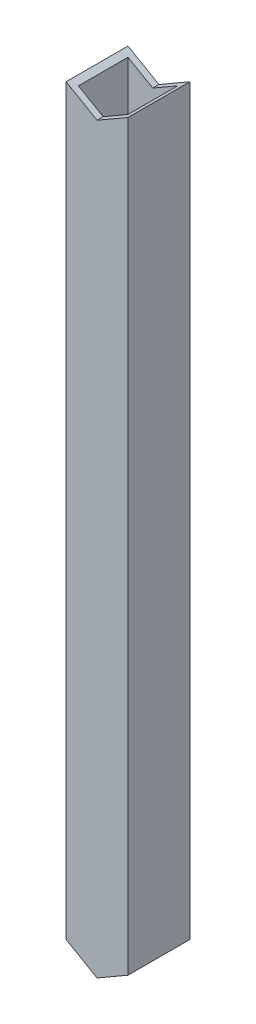
ISO-10303-21;
HEADER;
FILE_DESCRIPTION(('STEP AP214'),'2;1');
FILE_NAME('part.step','',(''),(''),'','','');
FILE_SCHEMA(('AUTOMOTIVE_DESIGN { 1 0 10303 214 1 1 1 1 }'));
ENDSEC;
DATA;
#1=APPLICATION_CONTEXT('core data for automotive mechanical design processes');
#2=APPLICATION_PROTOCOL_DEFINITION('international standard','automotive_design',2000,#1);
#3=PRODUCT_CONTEXT('',#1,'mechanical');
#4=PRODUCT('Part','Part','',(#3));
#5=PRODUCT_RELATED_PRODUCT_CATEGORY('part','',(#4));
#6=PRODUCT_DEFINITION_FORMATION('','',#4);
#7=PRODUCT_DEFINITION_CONTEXT('part definition',#1,'design');
#8=PRODUCT_DEFINITION('design','',#6,#7);
#9=PRODUCT_DEFINITION_SHAPE('','',#8);
#10=(LENGTH_UNIT() NAMED_UNIT(*) SI_UNIT(.MILLI.,.METRE.));
#11=(NAMED_UNIT(*) PLANE_ANGLE_UNIT() SI_UNIT($,.RADIAN.));
#12=(NAMED_UNIT(*) SI_UNIT($,.STERADIAN.) SOLID_ANGLE_UNIT());
#13=UNCERTAINTY_MEASURE_WITH_UNIT(LENGTH_MEASURE(1.E-05),#10,'distance_accuracy_value','');
#14=(GEOMETRIC_REPRESENTATION_CONTEXT(3) GLOBAL_UNCERTAINTY_ASSIGNED_CONTEXT((#13)) GLOBAL_UNIT_ASSIGNED_CONTEXT((#10,
#11,#12)) REPRESENTATION_CONTEXT('',''));
#15=CARTESIAN_POINT('',(0.,0.,0.));
#16=DIRECTION('',(0.,0.,1.));
#17=DIRECTION('',(1.,0.,0.));
#18=AXIS2_PLACEMENT_3D('',#15,#16,#17);
#19=CARTESIAN_POINT('',(0.,0.,50.));
#20=DIRECTION('',(-0.500000000000004,-0.866025403784436,0.));
#21=DIRECTION('',(0.866025403784436,-0.500000000000004,0.));
#22=AXIS2_PLACEMENT_3D('',#19,#20,#21);
#23=PLANE('',#22);
#24=DIRECTION('',(0.,0.,-1.));
#25=VECTOR('',#24,1.);
#26=CARTESIAN_POINT('',(-20.,11.5470053837926,50.));
#27=LINE('',#26,#25);
#28=CARTESIAN_POINT('',(-20.,11.5470053837926,45.));
#29=VERTEX_POINT('',#28);
#30=CARTESIAN_POINT('',(-20.,11.5470053837926,5.));
#31=VERTEX_POINT('',#30);
#32=EDGE_CURVE('E181',#29,#31,#27,.T.);
#33=ORIENTED_EDGE('',*,*,#32,.T.);
#34=DIRECTION('',(0.866025403784436,-0.500000000000004,0.));
#35=VECTOR('',#34,1.);
#36=CARTESIAN_POINT('',(0.,0.,5.));
#37=LINE('',#36,#35);
#38=CARTESIAN_POINT('',(0.,0.,5.));
#39=VERTEX_POINT('',#38);
#40=EDGE_CURVE('E202',#31,#39,#37,.T.);
#41=ORIENTED_EDGE('',*,*,#40,.T.);
#42=DIRECTION('',(0.,0.,-1.));
#43=VECTOR('',#42,1.);
#44=CARTESIAN_POINT('',(0.,0.,50.));
#45=LINE('',#44,#43);
#46=CARTESIAN_POINT('',(0.,0.,0.));
#47=VERTEX_POINT('',#46);
#48=EDGE_CURVE('E164',#39,#47,#45,.T.);
#49=ORIENTED_EDGE('',*,*,#48,.T.);
#50=DIRECTION('',(-0.866025403784436,0.500000000000004,0.));
#51=VECTOR('',#50,1.);
#52=CARTESIAN_POINT('',(0.,0.,0.));
#53=LINE('',#52,#51);
#54=CARTESIAN_POINT('',(-25.,14.4337567297408,0.));
#55=VERTEX_POINT('',#54);
#56=EDGE_CURVE('E178',#47,#55,#53,.T.);
#57=ORIENTED_EDGE('',*,*,#56,.T.);
#58=DIRECTION('',(0.,0.,-1.));
#59=VECTOR('',#58,1.);
#60=CARTESIAN_POINT('',(-25.,14.4337567297408,50.));
#61=LINE('',#60,#59);
#62=CARTESIAN_POINT('',(-25.,14.4337567297408,50.));
#63=VERTEX_POINT('',#62);
#64=EDGE_CURVE('E130',#63,#55,#61,.T.);
#65=ORIENTED_EDGE('',*,*,#64,.F.);
#66=DIRECTION('',(-0.866025403784436,0.500000000000004,0.));
#67=VECTOR('',#66,1.);
#68=CARTESIAN_POINT('',(0.,0.,50.));
#69=LINE('',#68,#67);
#70=CARTESIAN_POINT('',(0.,0.,50.));
#71=VERTEX_POINT('',#70);
#72=EDGE_CURVE('E168',#71,#63,#69,.T.);
#73=ORIENTED_EDGE('',*,*,#72,.F.);
#74=CARTESIAN_POINT('',(0.,0.,45.));
#75=VERTEX_POINT('',#74);
#76=EDGE_CURVE('E162',#71,#75,#45,.T.);
#77=ORIENTED_EDGE('',*,*,#76,.T.);
#78=DIRECTION('',(-0.866025403784436,0.500000000000004,0.));
#79=VECTOR('',#78,1.);
#80=CARTESIAN_POINT('',(0.,0.,45.));
#81=LINE('',#80,#79);
#82=EDGE_CURVE('E58',#75,#29,#81,.T.);
#83=ORIENTED_EDGE('',*,*,#82,.T.);
#84=EDGE_LOOP('',(#33,#41,#49,#57,#65,#73,#77,#83));
#85=FACE_BOUND('',#84,.T.);
#86=ADVANCED_FACE('F38',(#85),#23,.F.);
#87=CARTESIAN_POINT('',(-25.,14.4337567297408,50.));
#88=DIRECTION('',(1.,0.,0.));
#89=DIRECTION('',(0.,1.,0.));
#90=AXIS2_PLACEMENT_3D('',#87,#88,#89);
#91=PLANE('',#90);
#92=DIRECTION('',(0.,-1.,0.));
#93=VECTOR('',#92,1.);
#94=CARTESIAN_POINT('',(-25.,14.4337567297408,0.));
#95=LINE('',#94,#93);
#96=CARTESIAN_POINT('',(-24.9999999999999,-585.566243270259,0.));
#97=VERTEX_POINT('',#96);
#98=EDGE_CURVE('E176',#55,#97,#95,.T.);
#99=ORIENTED_EDGE('',*,*,#98,.T.);
#100=DIRECTION('',(0.,0.,-1.));
#101=VECTOR('',#100,1.);
#102=CARTESIAN_POINT('',(-24.9999999999999,-585.566243270259,50.));
#103=LINE('',#102,#101);
#104=CARTESIAN_POINT('',(-24.9999999999999,-585.566243270259,50.));
#105=VERTEX_POINT('',#104);
#106=EDGE_CURVE('E149',#105,#97,#103,.T.);
#107=ORIENTED_EDGE('',*,*,#106,.F.);
#108=DIRECTION('',(0.,-1.,0.));
#109=VECTOR('',#108,1.);
#110=CARTESIAN_POINT('',(-25.,14.4337567297408,50.));
#111=LINE('',#110,#109);
#112=EDGE_CURVE('E190',#63,#105,#111,.T.);
#113=ORIENTED_EDGE('',*,*,#112,.F.);
#114=ORIENTED_EDGE('',*,*,#64,.T.);
#115=EDGE_LOOP('',(#99,#107,#113,#114));
#116=FACE_BOUND('',#115,.T.);
#117=ADVANCED_FACE('F241',(#116),#91,.F.);
#118=CARTESIAN_POINT('',(-24.9999999999999,-585.566243270259,50.));
#119=DIRECTION('',(0.500000000000004,0.866025403784437,0.));
#120=DIRECTION('',(-0.866025403784437,0.500000000000004,0.));
#121=AXIS2_PLACEMENT_3D('',#118,#119,#120);
#122=PLANE('',#121);
#123=DIRECTION('',(0.,0.,-1.));
#124=VECTOR('',#123,1.);
#125=CARTESIAN_POINT('',(0.,-600.,50.));
#126=LINE('',#125,#124);
#127=CARTESIAN_POINT('',(0.,-600.,5.));
#128=VERTEX_POINT('',#127);
#129=CARTESIAN_POINT('',(0.,-600.,0.));
#130=VERTEX_POINT('',#129);
#131=EDGE_CURVE('E155',#128,#130,#126,.T.);
#132=ORIENTED_EDGE('',*,*,#131,.F.);
#133=DIRECTION('',(-0.866025403784437,0.500000000000004,0.));
#134=VECTOR('',#133,1.);
#135=CARTESIAN_POINT('',(-24.9999999999999,-585.566243270259,5.));
#136=LINE('',#135,#134);
#137=CARTESIAN_POINT('',(-20.,-588.452994616207,5.));
#138=VERTEX_POINT('',#137);
#139=EDGE_CURVE('E196',#128,#138,#136,.T.);
#140=ORIENTED_EDGE('',*,*,#139,.T.);
#141=DIRECTION('',(0.,0.,1.));
#142=VECTOR('',#141,1.);
#143=CARTESIAN_POINT('',(-20.,-588.452994616207,50.));
#144=LINE('',#143,#142);
#145=CARTESIAN_POINT('',(-20.,-588.452994616207,45.));
#146=VERTEX_POINT('',#145);
#147=EDGE_CURVE('E11',#138,#146,#144,.T.);
#148=ORIENTED_EDGE('',*,*,#147,.T.);
#149=DIRECTION('',(0.866025403784437,-0.500000000000004,0.));
#150=VECTOR('',#149,1.);
#151=CARTESIAN_POINT('',(-24.9999999999999,-585.566243270259,45.));
#152=LINE('',#151,#150);
#153=CARTESIAN_POINT('',(0.,-600.,45.));
#154=VERTEX_POINT('',#153);
#155=EDGE_CURVE('E206',#146,#154,#152,.T.);
#156=ORIENTED_EDGE('',*,*,#155,.T.);
#157=CARTESIAN_POINT('',(0.,-600.,50.));
#158=VERTEX_POINT('',#157);
#159=EDGE_CURVE('E152',#158,#154,#126,.T.);
#160=ORIENTED_EDGE('',*,*,#159,.F.);
#161=DIRECTION('',(0.866025403784437,-0.500000000000004,0.));
#162=VECTOR('',#161,1.);
#163=CARTESIAN_POINT('',(-24.9999999999999,-585.566243270259,50.));
#164=LINE('',#163,#162);
#165=EDGE_CURVE('E188',#105,#158,#164,.T.);
#166=ORIENTED_EDGE('',*,*,#165,.F.);
#167=ORIENTED_EDGE('',*,*,#106,.T.);
#168=DIRECTION('',(0.866025403784437,-0.500000000000004,0.));
#169=VECTOR('',#168,1.);
#170=CARTESIAN_POINT('',(-24.9999999999999,-585.566243270259,0.));
#171=LINE('',#170,#169);
#172=EDGE_CURVE('E173',#97,#130,#171,.T.);
#173=ORIENTED_EDGE('',*,*,#172,.T.);
#174=EDGE_LOOP('',(#132,#140,#148,#156,#160,#166,#167,#173));
#175=FACE_BOUND('',#174,.T.);
#176=ADVANCED_FACE('F247',(#175),#122,.F.);
#177=CARTESIAN_POINT('',(25.0000000000001,-585.566243270259,50.));
#178=DIRECTION('',(-0.499999999999998,0.86602540378444,0.));
#179=DIRECTION('',(-0.86602540378444,-0.499999999999998,0.));
#180=AXIS2_PLACEMENT_3D('',#177,#178,#179);
#181=PLANE('',#180);
#182=DIRECTION('',(0.,0.,-1.));
#183=VECTOR('',#182,1.);
#184=CARTESIAN_POINT('',(20.,-588.452994616208,50.));
#185=LINE('',#184,#183);
#186=CARTESIAN_POINT('',(20.,-588.452994616208,45.));
#187=VERTEX_POINT('',#186);
#188=CARTESIAN_POINT('',(20.,-588.452994616208,5.));
#189=VERTEX_POINT('',#188);
#190=EDGE_CURVE('E137',#187,#189,#185,.T.);
#191=ORIENTED_EDGE('',*,*,#190,.T.);
#192=DIRECTION('',(-0.86602540378444,-0.499999999999998,0.));
#193=VECTOR('',#192,1.);
#194=CARTESIAN_POINT('',(25.0000000000001,-585.566243270259,5.));
#195=LINE('',#194,#193);
#196=EDGE_CURVE('E199',#189,#128,#195,.T.);
#197=ORIENTED_EDGE('',*,*,#196,.T.);
#198=ORIENTED_EDGE('',*,*,#131,.T.);
#199=DIRECTION('',(0.86602540378444,0.499999999999998,0.));
#200=VECTOR('',#199,1.);
#201=CARTESIAN_POINT('',(25.0000000000001,-585.566243270259,0.));
#202=LINE('',#201,#200);
#203=CARTESIAN_POINT('',(25.0000000000001,-585.566243270259,0.));
#204=VERTEX_POINT('',#203);
#205=EDGE_CURVE('E171',#130,#204,#202,.T.);
#206=ORIENTED_EDGE('',*,*,#205,.T.);
#207=DIRECTION('',(0.,0.,-1.));
#208=VECTOR('',#207,1.);
#209=CARTESIAN_POINT('',(25.0000000000001,-585.566243270259,50.));
#210=LINE('',#209,#208);
#211=CARTESIAN_POINT('',(25.0000000000001,-585.566243270259,50.));
#212=VERTEX_POINT('',#211);
#213=EDGE_CURVE('E156',#212,#204,#210,.T.);
#214=ORIENTED_EDGE('',*,*,#213,.F.);
#215=DIRECTION('',(0.86602540378444,0.499999999999998,0.));
#216=VECTOR('',#215,1.);
#217=CARTESIAN_POINT('',(25.0000000000001,-585.566243270259,50.));
#218=LINE('',#217,#216);
#219=EDGE_CURVE('E186',#158,#212,#218,.T.);
#220=ORIENTED_EDGE('',*,*,#219,.F.);
#221=ORIENTED_EDGE('',*,*,#159,.T.);
#222=DIRECTION('',(0.86602540378444,0.499999999999998,0.));
#223=VECTOR('',#222,1.);
#224=CARTESIAN_POINT('',(25.0000000000001,-585.566243270259,45.));
#225=LINE('',#224,#223);
#226=EDGE_CURVE('E209',#154,#187,#225,.T.);
#227=ORIENTED_EDGE('',*,*,#226,.T.);
#228=EDGE_LOOP('',(#191,#197,#198,#206,#214,#220,#221,#227));
#229=FACE_BOUND('',#228,.T.);
#230=ADVANCED_FACE('F249',(#229),#181,.F.);
#231=CARTESIAN_POINT('',(25.,14.4337567297408,50.));
#232=DIRECTION('',(-1.,0.,0.));
#233=DIRECTION('',(0.,-1.,0.));
#234=AXIS2_PLACEMENT_3D('',#231,#232,#233);
#235=PLANE('',#234);
#236=DIRECTION('',(0.,1.,0.));
#237=VECTOR('',#236,1.);
#238=CARTESIAN_POINT('',(25.,14.4337567297408,0.));
#239=LINE('',#238,#237);
#240=CARTESIAN_POINT('',(25.,14.4337567297408,0.));
#241=VERTEX_POINT('',#240);
#242=EDGE_CURVE('E169',#204,#241,#239,.T.);
#243=ORIENTED_EDGE('',*,*,#242,.T.);
#244=DIRECTION('',(0.,0.,-1.));
#245=VECTOR('',#244,1.);
#246=CARTESIAN_POINT('',(25.,14.4337567297408,50.));
#247=LINE('',#246,#245);
#248=CARTESIAN_POINT('',(25.,14.4337567297408,50.));
#249=VERTEX_POINT('',#248);
#250=EDGE_CURVE('E159',#249,#241,#247,.T.);
#251=ORIENTED_EDGE('',*,*,#250,.F.);
#252=DIRECTION('',(0.,1.,0.));
#253=VECTOR('',#252,1.);
#254=CARTESIAN_POINT('',(25.,14.4337567297408,50.));
#255=LINE('',#254,#253);
#256=EDGE_CURVE('E184',#212,#249,#255,.T.);
#257=ORIENTED_EDGE('',*,*,#256,.F.);
#258=ORIENTED_EDGE('',*,*,#213,.T.);
#259=EDGE_LOOP('',(#243,#251,#257,#258));
#260=FACE_BOUND('',#259,.T.);
#261=ADVANCED_FACE('F233',(#260),#235,.F.);
#262=CARTESIAN_POINT('',(0.,0.,50.));
#263=DIRECTION('',(0.500000000000004,-0.866025403784436,0.));
#264=DIRECTION('',(0.866025403784436,0.500000000000004,0.));
#265=AXIS2_PLACEMENT_3D('',#262,#263,#264);
#266=PLANE('',#265);
#267=ORIENTED_EDGE('',*,*,#48,.F.);
#268=DIRECTION('',(0.866025403784436,0.500000000000004,0.));
#269=VECTOR('',#268,1.);
#270=CARTESIAN_POINT('',(0.,0.,5.));
#271=LINE('',#270,#269);
#272=CARTESIAN_POINT('',(20.,11.5470053837926,5.));
#273=VERTEX_POINT('',#272);
#274=EDGE_CURVE('E45',#39,#273,#271,.T.);
#275=ORIENTED_EDGE('',*,*,#274,.T.);
#276=DIRECTION('',(0.,0.,1.));
#277=VECTOR('',#276,1.);
#278=CARTESIAN_POINT('',(20.,11.5470053837927,50.));
#279=LINE('',#278,#277);
#280=CARTESIAN_POINT('',(20.,11.5470053837926,45.));
#281=VERTEX_POINT('',#280);
#282=EDGE_CURVE('E129',#273,#281,#279,.T.);
#283=ORIENTED_EDGE('',*,*,#282,.T.);
#284=DIRECTION('',(-0.866025403784436,-0.500000000000004,0.));
#285=VECTOR('',#284,1.);
#286=CARTESIAN_POINT('',(0.,0.,45.));
#287=LINE('',#286,#285);
#288=EDGE_CURVE('E123',#281,#75,#287,.T.);
#289=ORIENTED_EDGE('',*,*,#288,.T.);
#290=ORIENTED_EDGE('',*,*,#76,.F.);
#291=DIRECTION('',(-0.866025403784436,-0.500000000000004,0.));
#292=VECTOR('',#291,1.);
#293=CARTESIAN_POINT('',(0.,0.,50.));
#294=LINE('',#293,#292);
#295=EDGE_CURVE('E182',#249,#71,#294,.T.);
#296=ORIENTED_EDGE('',*,*,#295,.F.);
#297=ORIENTED_EDGE('',*,*,#250,.T.);
#298=DIRECTION('',(-0.866025403784436,-0.500000000000004,0.));
#299=VECTOR('',#298,1.);
#300=CARTESIAN_POINT('',(0.,0.,0.));
#301=LINE('',#300,#299);
#302=EDGE_CURVE('E165',#241,#47,#301,.T.);
#303=ORIENTED_EDGE('',*,*,#302,.T.);
#304=EDGE_LOOP('',(#267,#275,#283,#289,#290,#296,#297,#303));
#305=FACE_BOUND('',#304,.T.);
#306=ADVANCED_FACE('F144',(#305),#266,.F.);
#307=CARTESIAN_POINT('',(0.,0.,50.));
#308=DIRECTION('',(0.,0.,1.));
#309=DIRECTION('',(1.,0.,0.));
#310=AXIS2_PLACEMENT_3D('',#307,#308,#309);
#311=PLANE('',#310);
#312=ORIENTED_EDGE('',*,*,#72,.T.);
#313=ORIENTED_EDGE('',*,*,#112,.T.);
#314=ORIENTED_EDGE('',*,*,#165,.T.);
#315=ORIENTED_EDGE('',*,*,#219,.T.);
#316=ORIENTED_EDGE('',*,*,#256,.T.);
#317=ORIENTED_EDGE('',*,*,#295,.T.);
#318=EDGE_LOOP('',(#312,#313,#314,#315,#316,#317));
#319=FACE_BOUND('',#318,.T.);
#320=ADVANCED_FACE('F228',(#319),#311,.T.);
#321=CARTESIAN_POINT('',(0.,0.,0.));
#322=DIRECTION('',(0.,0.,1.));
#323=DIRECTION('',(1.,0.,0.));
#324=AXIS2_PLACEMENT_3D('',#321,#322,#323);
#325=PLANE('',#324);
#326=ORIENTED_EDGE('',*,*,#56,.F.);
#327=ORIENTED_EDGE('',*,*,#302,.F.);
#328=ORIENTED_EDGE('',*,*,#242,.F.);
#329=ORIENTED_EDGE('',*,*,#205,.F.);
#330=ORIENTED_EDGE('',*,*,#172,.F.);
#331=ORIENTED_EDGE('',*,*,#98,.F.);
#332=EDGE_LOOP('',(#326,#327,#328,#329,#330,#331));
#333=FACE_BOUND('',#332,.T.);
#334=ADVANCED_FACE('F238',(#333),#325,.F.);
#335=CARTESIAN_POINT('',(-20.,-600.,45.));
#336=DIRECTION('',(-1.,0.,0.));
#337=DIRECTION('',(0.,0.,1.));
#338=AXIS2_PLACEMENT_3D('',#335,#336,#337);
#339=PLANE('',#338);
#340=DIRECTION('',(0.,1.,0.));
#341=VECTOR('',#340,1.);
#342=CARTESIAN_POINT('',(-20.,-600.,45.));
#343=LINE('',#342,#341);
#344=EDGE_CURVE('E140',#146,#29,#343,.T.);
#345=ORIENTED_EDGE('',*,*,#344,.F.);
#346=ORIENTED_EDGE('',*,*,#147,.F.);
#347=DIRECTION('',(0.,1.,0.));
#348=VECTOR('',#347,1.);
#349=CARTESIAN_POINT('',(-20.,-600.,5.));
#350=LINE('',#349,#348);
#351=EDGE_CURVE('E212',#138,#31,#350,.T.);
#352=ORIENTED_EDGE('',*,*,#351,.T.);
#353=ORIENTED_EDGE('',*,*,#32,.F.);
#354=EDGE_LOOP('',(#345,#346,#352,#353));
#355=FACE_BOUND('',#354,.T.);
#356=ADVANCED_FACE('F219',(#355),#339,.F.);
#357=CARTESIAN_POINT('',(-20.,-600.,5.));
#358=DIRECTION('',(0.,0.,-1.));
#359=DIRECTION('',(-1.,0.,0.));
#360=AXIS2_PLACEMENT_3D('',#357,#358,#359);
#361=PLANE('',#360);
#362=ORIENTED_EDGE('',*,*,#196,.F.);
#363=DIRECTION('',(0.,1.,0.));
#364=VECTOR('',#363,1.);
#365=CARTESIAN_POINT('',(20.,-600.,5.));
#366=LINE('',#365,#364);
#367=EDGE_CURVE('E139',#189,#273,#366,.T.);
#368=ORIENTED_EDGE('',*,*,#367,.T.);
#369=ORIENTED_EDGE('',*,*,#274,.F.);
#370=ORIENTED_EDGE('',*,*,#40,.F.);
#371=ORIENTED_EDGE('',*,*,#351,.F.);
#372=ORIENTED_EDGE('',*,*,#139,.F.);
#373=EDGE_LOOP('',(#362,#368,#369,#370,#371,#372));
#374=FACE_BOUND('',#373,.T.);
#375=ADVANCED_FACE('F250',(#374),#361,.F.);
#376=CARTESIAN_POINT('',(20.,-600.,5.));
#377=DIRECTION('',(1.,0.,0.));
#378=DIRECTION('',(0.,0.,-1.));
#379=AXIS2_PLACEMENT_3D('',#376,#377,#378);
#380=PLANE('',#379);
#381=DIRECTION('',(0.,1.,0.));
#382=VECTOR('',#381,1.);
#383=CARTESIAN_POINT('',(20.,-600.,45.));
#384=LINE('',#383,#382);
#385=EDGE_CURVE('E52',#187,#281,#384,.T.);
#386=ORIENTED_EDGE('',*,*,#385,.T.);
#387=ORIENTED_EDGE('',*,*,#282,.F.);
#388=ORIENTED_EDGE('',*,*,#367,.F.);
#389=ORIENTED_EDGE('',*,*,#190,.F.);
#390=EDGE_LOOP('',(#386,#387,#388,#389));
#391=FACE_BOUND('',#390,.T.);
#392=ADVANCED_FACE('F133',(#391),#380,.F.);
#393=CARTESIAN_POINT('',(20.,-600.,45.));
#394=DIRECTION('',(0.,0.,1.));
#395=DIRECTION('',(1.,0.,0.));
#396=AXIS2_PLACEMENT_3D('',#393,#394,#395);
#397=PLANE('',#396);
#398=ORIENTED_EDGE('',*,*,#344,.T.);
#399=ORIENTED_EDGE('',*,*,#82,.F.);
#400=ORIENTED_EDGE('',*,*,#288,.F.);
#401=ORIENTED_EDGE('',*,*,#385,.F.);
#402=ORIENTED_EDGE('',*,*,#226,.F.);
#403=ORIENTED_EDGE('',*,*,#155,.F.);
#404=EDGE_LOOP('',(#398,#399,#400,#401,#402,#403));
#405=FACE_BOUND('',#404,.T.);
#406=ADVANCED_FACE('F124',(#405),#397,.F.);
#407=CLOSED_SHELL('',(#86,#117,#176,#230,#261,#306,#320,#334,#356,#375,#392,#406));
#408=MANIFOLD_SOLID_BREP('B2',#407);
#409=ADVANCED_BREP_SHAPE_REPRESENTATION('',(#18,#408),#14);
#410=SHAPE_DEFINITION_REPRESENTATION(#9,#409);
ENDSEC;
END-ISO-10303-21;
